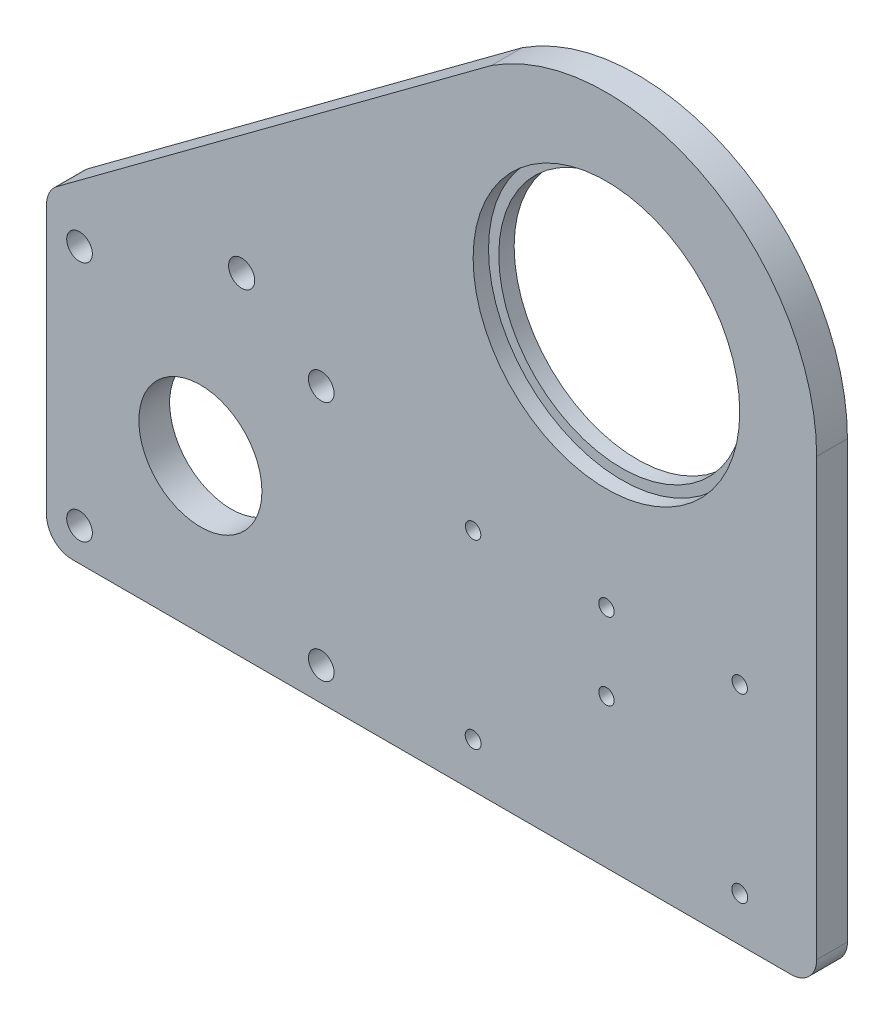
ISO-10303-21;
HEADER;
FILE_DESCRIPTION(('STEP AP214'),'2;1');
FILE_NAME('part.step','',(''),(''),'','','');
FILE_SCHEMA(('AUTOMOTIVE_DESIGN { 1 0 10303 214 1 1 1 1 }'));
ENDSEC;
DATA;
#1=APPLICATION_CONTEXT('core data for automotive mechanical design processes');
#2=APPLICATION_PROTOCOL_DEFINITION('international standard','automotive_design',2000,#1);
#3=PRODUCT_CONTEXT('',#1,'mechanical');
#4=PRODUCT('Part','Part','',(#3));
#5=PRODUCT_RELATED_PRODUCT_CATEGORY('part','',(#4));
#6=PRODUCT_DEFINITION_FORMATION('','',#4);
#7=PRODUCT_DEFINITION_CONTEXT('part definition',#1,'design');
#8=PRODUCT_DEFINITION('design','',#6,#7);
#9=PRODUCT_DEFINITION_SHAPE('','',#8);
#10=(LENGTH_UNIT() NAMED_UNIT(*) SI_UNIT(.MILLI.,.METRE.));
#11=(NAMED_UNIT(*) PLANE_ANGLE_UNIT() SI_UNIT($,.RADIAN.));
#12=(NAMED_UNIT(*) SI_UNIT($,.STERADIAN.) SOLID_ANGLE_UNIT());
#13=UNCERTAINTY_MEASURE_WITH_UNIT(LENGTH_MEASURE(1.E-05),#10,'distance_accuracy_value','');
#14=(GEOMETRIC_REPRESENTATION_CONTEXT(3) GLOBAL_UNCERTAINTY_ASSIGNED_CONTEXT((#13)) GLOBAL_UNIT_ASSIGNED_CONTEXT((#10,
#11,#12)) REPRESENTATION_CONTEXT('',''));
#15=CARTESIAN_POINT('',(0.,0.,0.));
#16=DIRECTION('',(0.,0.,1.));
#17=DIRECTION('',(1.,0.,0.));
#18=AXIS2_PLACEMENT_3D('',#15,#16,#17);
#19=CARTESIAN_POINT('',(79.1876354946597,59.9978406675183,10.));
#20=DIRECTION('',(0.,0.,-1.));
#21=DIRECTION('',(-1.,0.,0.));
#22=AXIS2_PLACEMENT_3D('',#19,#20,#21);
#23=CYLINDRICAL_SURFACE('',#22,26.);
#24=CARTESIAN_POINT('',(79.1876354946597,59.9978406675183,3.));
#25=DIRECTION('',(0.,0.,-1.));
#26=DIRECTION('',(-1.,0.,0.));
#27=AXIS2_PLACEMENT_3D('',#24,#25,#26);
#28=CIRCLE('',#27,26.);
#29=CARTESIAN_POINT('',(53.1876354946597,59.9978406675183,3.));
#30=VERTEX_POINT('',#29);
#31=EDGE_CURVE('E159',#30,#30,#28,.T.);
#32=ORIENTED_EDGE('',*,*,#31,.T.);
#33=EDGE_LOOP('',(#32));
#34=FACE_BOUND('',#33,.T.);
#35=CARTESIAN_POINT('',(79.1876354946597,59.9978406675183,6.));
#36=DIRECTION('',(0.,0.,1.));
#37=DIRECTION('',(1.,0.,0.));
#38=AXIS2_PLACEMENT_3D('',#35,#36,#37);
#39=CIRCLE('',#38,26.);
#40=CARTESIAN_POINT('',(105.18763549466,59.9978406675183,6.));
#41=VERTEX_POINT('',#40);
#42=EDGE_CURVE('E183',#41,#41,#39,.T.);
#43=ORIENTED_EDGE('',*,*,#42,.T.);
#44=EDGE_LOOP('',(#43));
#45=FACE_BOUND('',#44,.T.);
#46=ADVANCED_FACE('F38',(#34,#45),#23,.F.);
#47=CARTESIAN_POINT('',(-24.9923103548989,33.7123951906585,10.));
#48=DIRECTION('',(-0.595537784474957,0.803327297720338,0.));
#49=DIRECTION('',(-0.803327297720338,-0.595537784474957,0.));
#50=AXIS2_PLACEMENT_3D('',#47,#48,#49);
#51=PLANE('',#50);
#52=DIRECTION('',(0.,0.,-1.));
#53=VECTOR('',#52,1.);
#54=CARTESIAN_POINT('',(-27.9776889223748,31.499217893013,10.));
#55=LINE('',#54,#53);
#56=CARTESIAN_POINT('',(-27.9776889223748,31.499217893013,0.));
#57=VERTEX_POINT('',#56);
#58=CARTESIAN_POINT('',(-27.9776889223748,31.499217893013,6.));
#59=VERTEX_POINT('',#58);
#60=EDGE_CURVE('E11',#57,#59,#55,.F.);
#61=ORIENTED_EDGE('',*,*,#60,.T.);
#62=DIRECTION('',(-0.803327297720337,-0.595537784474957,0.));
#63=VECTOR('',#62,1.);
#64=CARTESIAN_POINT('',(56.774720343008,94.3294767253129,6.));
#65=LINE('',#64,#63);
#66=CARTESIAN_POINT('',(56.774720343008,94.3294767253129,6.));
#67=VERTEX_POINT('',#66);
#68=EDGE_CURVE('E53',#67,#59,#65,.T.);
#69=ORIENTED_EDGE('',*,*,#68,.F.);
#70=DIRECTION('',(0.,0.,-1.));
#71=VECTOR('',#70,1.);
#72=CARTESIAN_POINT('',(56.774720343008,94.3294767253129,10.));
#73=LINE('',#72,#71);
#74=CARTESIAN_POINT('',(56.774720343008,94.3294767253129,0.));
#75=VERTEX_POINT('',#74);
#76=EDGE_CURVE('E143',#67,#75,#73,.T.);
#77=ORIENTED_EDGE('',*,*,#76,.T.);
#78=DIRECTION('',(0.803327297720337,0.595537784474957,0.));
#79=VECTOR('',#78,1.);
#80=CARTESIAN_POINT('',(-24.9923103548989,33.7123951906585,0.));
#81=LINE('',#80,#79);
#82=EDGE_CURVE('E156',#57,#75,#81,.T.);
#83=ORIENTED_EDGE('',*,*,#82,.F.);
#84=EDGE_LOOP('',(#61,#69,#77,#83));
#85=FACE_BOUND('',#84,.T.);
#86=ADVANCED_FACE('F308',(#85),#51,.T.);
#87=CARTESIAN_POINT('',(-30.,0.,10.));
#88=DIRECTION('',(-1.,0.,0.));
#89=DIRECTION('',(0.,0.,1.));
#90=AXIS2_PLACEMENT_3D('',#87,#88,#89);
#91=PLANE('',#90);
#92=DIRECTION('',(0.,0.,-1.));
#93=VECTOR('',#92,1.);
#94=CARTESIAN_POINT('',(-30.,-25.,10.));
#95=LINE('',#94,#93);
#96=CARTESIAN_POINT('',(-30.,-25.,0.));
#97=VERTEX_POINT('',#96);
#98=CARTESIAN_POINT('',(-30.,-25.,6.));
#99=VERTEX_POINT('',#98);
#100=EDGE_CURVE('E128',#97,#99,#95,.F.);
#101=ORIENTED_EDGE('',*,*,#100,.T.);
#102=DIRECTION('',(0.,-1.,0.));
#103=VECTOR('',#102,1.);
#104=CARTESIAN_POINT('',(-30.,27.4825814044113,6.));
#105=LINE('',#104,#103);
#106=CARTESIAN_POINT('',(-30.,27.4825814044113,6.));
#107=VERTEX_POINT('',#106);
#108=EDGE_CURVE('E201',#107,#99,#105,.T.);
#109=ORIENTED_EDGE('',*,*,#108,.F.);
#110=DIRECTION('',(0.,0.,-1.));
#111=VECTOR('',#110,1.);
#112=CARTESIAN_POINT('',(-30.,27.4825814044113,10.));
#113=LINE('',#112,#111);
#114=CARTESIAN_POINT('',(-30.,27.4825814044113,0.));
#115=VERTEX_POINT('',#114);
#116=EDGE_CURVE('E61',#107,#115,#113,.T.);
#117=ORIENTED_EDGE('',*,*,#116,.T.);
#118=DIRECTION('',(0.,1.,0.));
#119=VECTOR('',#118,1.);
#120=CARTESIAN_POINT('',(-30.,0.,0.));
#121=LINE('',#120,#119);
#122=EDGE_CURVE('E153',#97,#115,#121,.T.);
#123=ORIENTED_EDGE('',*,*,#122,.F.);
#124=EDGE_LOOP('',(#101,#109,#117,#123));
#125=FACE_BOUND('',#124,.T.);
#126=ADVANCED_FACE('F314',(#125),#91,.T.);
#127=CARTESIAN_POINT('',(0.,-30.,10.));
#128=DIRECTION('',(0.,-1.,0.));
#129=DIRECTION('',(0.,0.,-1.));
#130=AXIS2_PLACEMENT_3D('',#127,#128,#129);
#131=PLANE('',#130);
#132=DIRECTION('',(0.,0.,-1.));
#133=VECTOR('',#132,1.);
#134=CARTESIAN_POINT('',(115.18763549466,-30.,10.));
#135=LINE('',#134,#133);
#136=CARTESIAN_POINT('',(115.18763549466,-30.,0.));
#137=VERTEX_POINT('',#136);
#138=CARTESIAN_POINT('',(115.18763549466,-30.,6.));
#139=VERTEX_POINT('',#138);
#140=EDGE_CURVE('E140',#137,#139,#135,.F.);
#141=ORIENTED_EDGE('',*,*,#140,.T.);
#142=DIRECTION('',(1.,0.,0.));
#143=VECTOR('',#142,1.);
#144=CARTESIAN_POINT('',(-25.,-30.,6.));
#145=LINE('',#144,#143);
#146=CARTESIAN_POINT('',(-25.,-30.,6.));
#147=VERTEX_POINT('',#146);
#148=EDGE_CURVE('E110',#147,#139,#145,.T.);
#149=ORIENTED_EDGE('',*,*,#148,.F.);
#150=DIRECTION('',(0.,0.,-1.));
#151=VECTOR('',#150,1.);
#152=CARTESIAN_POINT('',(-25.,-30.,10.));
#153=LINE('',#152,#151);
#154=CARTESIAN_POINT('',(-25.,-30.,0.));
#155=VERTEX_POINT('',#154);
#156=EDGE_CURVE('E138',#147,#155,#153,.T.);
#157=ORIENTED_EDGE('',*,*,#156,.T.);
#158=DIRECTION('',(-1.,0.,0.));
#159=VECTOR('',#158,1.);
#160=CARTESIAN_POINT('',(0.,-30.,0.));
#161=LINE('',#160,#159);
#162=EDGE_CURVE('E150',#137,#155,#161,.T.);
#163=ORIENTED_EDGE('',*,*,#162,.F.);
#164=EDGE_LOOP('',(#141,#149,#157,#163));
#165=FACE_BOUND('',#164,.T.);
#166=ADVANCED_FACE('F326',(#165),#131,.T.);
#167=CARTESIAN_POINT('',(120.18763549466,0.,10.));
#168=DIRECTION('',(1.,0.,0.));
#169=DIRECTION('',(0.,0.,-1.));
#170=AXIS2_PLACEMENT_3D('',#167,#168,#169);
#171=PLANE('',#170);
#172=DIRECTION('',(0.,0.,-1.));
#173=VECTOR('',#172,1.);
#174=CARTESIAN_POINT('',(120.18763549466,59.9978406675183,10.));
#175=LINE('',#174,#173);
#176=CARTESIAN_POINT('',(120.18763549466,59.9978406675183,6.));
#177=VERTEX_POINT('',#176);
#178=CARTESIAN_POINT('',(120.18763549466,59.9978406675183,0.));
#179=VERTEX_POINT('',#178);
#180=EDGE_CURVE('E122',#177,#179,#175,.T.);
#181=ORIENTED_EDGE('',*,*,#180,.F.);
#182=DIRECTION('',(0.,1.,0.));
#183=VECTOR('',#182,1.);
#184=CARTESIAN_POINT('',(120.18763549466,-25.,6.));
#185=LINE('',#184,#183);
#186=CARTESIAN_POINT('',(120.18763549466,-25.,6.));
#187=VERTEX_POINT('',#186);
#188=EDGE_CURVE('E107',#187,#177,#185,.T.);
#189=ORIENTED_EDGE('',*,*,#188,.F.);
#190=DIRECTION('',(0.,0.,-1.));
#191=VECTOR('',#190,1.);
#192=CARTESIAN_POINT('',(120.18763549466,-25.,10.));
#193=LINE('',#192,#191);
#194=CARTESIAN_POINT('',(120.18763549466,-25.,0.));
#195=VERTEX_POINT('',#194);
#196=EDGE_CURVE('E46',#187,#195,#193,.T.);
#197=ORIENTED_EDGE('',*,*,#196,.T.);
#198=DIRECTION('',(0.,-1.,0.));
#199=VECTOR('',#198,1.);
#200=CARTESIAN_POINT('',(120.18763549466,0.,0.));
#201=LINE('',#200,#199);
#202=EDGE_CURVE('E148',#179,#195,#201,.T.);
#203=ORIENTED_EDGE('',*,*,#202,.F.);
#204=EDGE_LOOP('',(#181,#189,#197,#203));
#205=FACE_BOUND('',#204,.T.);
#206=ADVANCED_FACE('F119',(#205),#171,.T.);
#207=CARTESIAN_POINT('',(79.1876354946597,59.9978406675183,10.));
#208=DIRECTION('',(0.,0.,-1.));
#209=DIRECTION('',(-1.,0.,0.));
#210=AXIS2_PLACEMENT_3D('',#207,#208,#209);
#211=CYLINDRICAL_SURFACE('',#210,41.);
#212=CARTESIAN_POINT('',(79.1876354946597,59.9978406675183,6.));
#213=DIRECTION('',(0.,0.,1.));
#214=DIRECTION('',(1.,0.,0.));
#215=AXIS2_PLACEMENT_3D('',#212,#213,#214);
#216=CIRCLE('',#215,41.);
#217=EDGE_CURVE('E123',#177,#67,#216,.T.);
#218=ORIENTED_EDGE('',*,*,#217,.F.);
#219=ORIENTED_EDGE('',*,*,#180,.T.);
#220=CARTESIAN_POINT('',(79.1876354946597,59.9978406675183,0.));
#221=DIRECTION('',(0.,0.,1.));
#222=DIRECTION('',(1.,0.,0.));
#223=AXIS2_PLACEMENT_3D('',#220,#221,#222);
#224=CIRCLE('',#223,41.);
#225=EDGE_CURVE('E145',#179,#75,#224,.T.);
#226=ORIENTED_EDGE('',*,*,#225,.T.);
#227=ORIENTED_EDGE('',*,*,#76,.F.);
#228=EDGE_LOOP('',(#218,#219,#226,#227));
#229=FACE_BOUND('',#228,.T.);
#230=ADVANCED_FACE('F319',(#229),#211,.T.);
#231=CARTESIAN_POINT('',(-25.,-25.,10.));
#232=DIRECTION('',(0.,0.,-1.));
#233=DIRECTION('',(-1.,0.,0.));
#234=AXIS2_PLACEMENT_3D('',#231,#232,#233);
#235=CYLINDRICAL_SURFACE('',#234,5.);
#236=ORIENTED_EDGE('',*,*,#156,.F.);
#237=CARTESIAN_POINT('',(-25.,-25.,6.));
#238=DIRECTION('',(0.,0.,1.));
#239=DIRECTION('',(1.,0.,0.));
#240=AXIS2_PLACEMENT_3D('',#237,#238,#239);
#241=CIRCLE('',#240,5.);
#242=EDGE_CURVE('E199',#99,#147,#241,.T.);
#243=ORIENTED_EDGE('',*,*,#242,.F.);
#244=ORIENTED_EDGE('',*,*,#100,.F.);
#245=CARTESIAN_POINT('',(-25.,-25.,0.));
#246=DIRECTION('',(0.,0.,1.));
#247=DIRECTION('',(1.,0.,0.));
#248=AXIS2_PLACEMENT_3D('',#245,#246,#247);
#249=CIRCLE('',#248,5.);
#250=EDGE_CURVE('E133',#155,#97,#249,.F.);
#251=ORIENTED_EDGE('',*,*,#250,.F.);
#252=EDGE_LOOP('',(#236,#243,#244,#251));
#253=FACE_BOUND('',#252,.T.);
#254=ADVANCED_FACE('F322',(#253),#235,.T.);
#255=CARTESIAN_POINT('',(115.18763549466,-25.,10.));
#256=DIRECTION('',(0.,0.,-1.));
#257=DIRECTION('',(-1.,0.,0.));
#258=AXIS2_PLACEMENT_3D('',#255,#256,#257);
#259=CYLINDRICAL_SURFACE('',#258,5.);
#260=ORIENTED_EDGE('',*,*,#196,.F.);
#261=CARTESIAN_POINT('',(115.18763549466,-25.,6.));
#262=DIRECTION('',(0.,0.,1.));
#263=DIRECTION('',(1.,0.,0.));
#264=AXIS2_PLACEMENT_3D('',#261,#262,#263);
#265=CIRCLE('',#264,5.);
#266=EDGE_CURVE('E103',#139,#187,#265,.T.);
#267=ORIENTED_EDGE('',*,*,#266,.F.);
#268=ORIENTED_EDGE('',*,*,#140,.F.);
#269=CARTESIAN_POINT('',(115.18763549466,-25.,0.));
#270=DIRECTION('',(0.,0.,1.));
#271=DIRECTION('',(1.,0.,0.));
#272=AXIS2_PLACEMENT_3D('',#269,#270,#271);
#273=CIRCLE('',#272,5.);
#274=EDGE_CURVE('E126',#195,#137,#273,.F.);
#275=ORIENTED_EDGE('',*,*,#274,.F.);
#276=EDGE_LOOP('',(#260,#267,#268,#275));
#277=FACE_BOUND('',#276,.T.);
#278=ADVANCED_FACE('F125',(#277),#259,.T.);
#279=CARTESIAN_POINT('',(-25.,27.4825814044113,10.));
#280=DIRECTION('',(0.,0.,-1.));
#281=DIRECTION('',(-1.,0.,0.));
#282=AXIS2_PLACEMENT_3D('',#279,#280,#281);
#283=CYLINDRICAL_SURFACE('',#282,5.);
#284=ORIENTED_EDGE('',*,*,#116,.F.);
#285=CARTESIAN_POINT('',(-25.,27.4825814044113,6.));
#286=DIRECTION('',(0.,0.,1.));
#287=DIRECTION('',(1.,0.,0.));
#288=AXIS2_PLACEMENT_3D('',#285,#286,#287);
#289=CIRCLE('',#288,5.);
#290=EDGE_CURVE('E203',#59,#107,#289,.T.);
#291=ORIENTED_EDGE('',*,*,#290,.F.);
#292=ORIENTED_EDGE('',*,*,#60,.F.);
#293=CARTESIAN_POINT('',(-25.,27.4825814044113,0.));
#294=DIRECTION('',(0.,0.,1.));
#295=DIRECTION('',(1.,0.,0.));
#296=AXIS2_PLACEMENT_3D('',#293,#294,#295);
#297=CIRCLE('',#296,5.);
#298=EDGE_CURVE('E136',#115,#57,#297,.F.);
#299=ORIENTED_EDGE('',*,*,#298,.F.);
#300=EDGE_LOOP('',(#284,#291,#292,#299));
#301=FACE_BOUND('',#300,.T.);
#302=ADVANCED_FACE('F40',(#301),#283,.T.);
#303=CARTESIAN_POINT('',(23.57,23.57,0.));
#304=DIRECTION('',(0.,0.,1.));
#305=DIRECTION('',(1.,0.,0.));
#306=AXIS2_PLACEMENT_3D('',#303,#304,#305);
#307=CYLINDRICAL_SURFACE('',#306,2.5);
#308=CARTESIAN_POINT('',(23.57,23.57,0.));
#309=DIRECTION('',(0.,0.,1.));
#310=DIRECTION('',(1.,0.,0.));
#311=AXIS2_PLACEMENT_3D('',#308,#309,#310);
#312=CIRCLE('',#311,2.5);
#313=CARTESIAN_POINT('',(26.07,23.57,0.));
#314=VERTEX_POINT('',#313);
#315=EDGE_CURVE('E166',#314,#314,#312,.T.);
#316=ORIENTED_EDGE('',*,*,#315,.F.);
#317=EDGE_LOOP('',(#316));
#318=FACE_BOUND('',#317,.T.);
#319=CARTESIAN_POINT('',(23.57,23.57,6.));
#320=DIRECTION('',(0.,0.,1.));
#321=DIRECTION('',(1.,0.,0.));
#322=AXIS2_PLACEMENT_3D('',#319,#320,#321);
#323=CIRCLE('',#322,2.5);
#324=CARTESIAN_POINT('',(26.07,23.57,6.));
#325=VERTEX_POINT('',#324);
#326=EDGE_CURVE('E186',#325,#325,#323,.F.);
#327=ORIENTED_EDGE('',*,*,#326,.F.);
#328=EDGE_LOOP('',(#327));
#329=FACE_BOUND('',#328,.T.);
#330=ADVANCED_FACE('F338',(#318,#329),#307,.F.);
#331=CARTESIAN_POINT('',(-23.57,-23.57,0.));
#332=DIRECTION('',(0.,0.,1.));
#333=DIRECTION('',(1.,0.,0.));
#334=AXIS2_PLACEMENT_3D('',#331,#332,#333);
#335=CYLINDRICAL_SURFACE('',#334,2.5);
#336=CARTESIAN_POINT('',(-23.57,-23.57,0.));
#337=DIRECTION('',(0.,0.,1.));
#338=DIRECTION('',(1.,0.,0.));
#339=AXIS2_PLACEMENT_3D('',#336,#337,#338);
#340=CIRCLE('',#339,2.5);
#341=CARTESIAN_POINT('',(-21.07,-23.57,0.));
#342=VERTEX_POINT('',#341);
#343=EDGE_CURVE('E171',#342,#342,#340,.T.);
#344=ORIENTED_EDGE('',*,*,#343,.F.);
#345=EDGE_LOOP('',(#344));
#346=FACE_BOUND('',#345,.T.);
#347=CARTESIAN_POINT('',(-23.57,-23.57,6.));
#348=DIRECTION('',(0.,0.,1.));
#349=DIRECTION('',(1.,0.,0.));
#350=AXIS2_PLACEMENT_3D('',#347,#348,#349);
#351=CIRCLE('',#350,2.5);
#352=CARTESIAN_POINT('',(-21.07,-23.57,6.));
#353=VERTEX_POINT('',#352);
#354=EDGE_CURVE('E189',#353,#353,#351,.F.);
#355=ORIENTED_EDGE('',*,*,#354,.F.);
#356=EDGE_LOOP('',(#355));
#357=FACE_BOUND('',#356,.T.);
#358=ADVANCED_FACE('F343',(#346,#357),#335,.F.);
#359=CARTESIAN_POINT('',(-23.57,23.57,0.));
#360=DIRECTION('',(0.,0.,1.));
#361=DIRECTION('',(1.,0.,0.));
#362=AXIS2_PLACEMENT_3D('',#359,#360,#361);
#363=CYLINDRICAL_SURFACE('',#362,2.5);
#364=CARTESIAN_POINT('',(-23.57,23.57,0.));
#365=DIRECTION('',(0.,0.,1.));
#366=DIRECTION('',(1.,0.,0.));
#367=AXIS2_PLACEMENT_3D('',#364,#365,#366);
#368=CIRCLE('',#367,2.5);
#369=CARTESIAN_POINT('',(-21.07,23.57,0.));
#370=VERTEX_POINT('',#369);
#371=EDGE_CURVE('E175',#370,#370,#368,.T.);
#372=ORIENTED_EDGE('',*,*,#371,.F.);
#373=EDGE_LOOP('',(#372));
#374=FACE_BOUND('',#373,.T.);
#375=CARTESIAN_POINT('',(-23.57,23.57,6.));
#376=DIRECTION('',(0.,0.,1.));
#377=DIRECTION('',(1.,0.,0.));
#378=AXIS2_PLACEMENT_3D('',#375,#376,#377);
#379=CIRCLE('',#378,2.5);
#380=CARTESIAN_POINT('',(-21.07,23.57,6.));
#381=VERTEX_POINT('',#380);
#382=EDGE_CURVE('E192',#381,#381,#379,.F.);
#383=ORIENTED_EDGE('',*,*,#382,.F.);
#384=EDGE_LOOP('',(#383));
#385=FACE_BOUND('',#384,.T.);
#386=ADVANCED_FACE('F356',(#374,#385),#363,.F.);
#387=CARTESIAN_POINT('',(23.57,-23.57,0.));
#388=DIRECTION('',(0.,0.,1.));
#389=DIRECTION('',(1.,0.,0.));
#390=AXIS2_PLACEMENT_3D('',#387,#388,#389);
#391=CYLINDRICAL_SURFACE('',#390,2.5);
#392=CARTESIAN_POINT('',(23.57,-23.57,0.));
#393=DIRECTION('',(0.,0.,1.));
#394=DIRECTION('',(1.,0.,0.));
#395=AXIS2_PLACEMENT_3D('',#392,#393,#394);
#396=CIRCLE('',#395,2.5);
#397=CARTESIAN_POINT('',(26.07,-23.57,0.));
#398=VERTEX_POINT('',#397);
#399=EDGE_CURVE('E172',#398,#398,#396,.T.);
#400=ORIENTED_EDGE('',*,*,#399,.F.);
#401=EDGE_LOOP('',(#400));
#402=FACE_BOUND('',#401,.T.);
#403=CARTESIAN_POINT('',(23.57,-23.57,6.));
#404=DIRECTION('',(0.,0.,1.));
#405=DIRECTION('',(1.,0.,0.));
#406=AXIS2_PLACEMENT_3D('',#403,#404,#405);
#407=CIRCLE('',#406,2.5);
#408=CARTESIAN_POINT('',(26.07,-23.57,6.));
#409=VERTEX_POINT('',#408);
#410=EDGE_CURVE('E195',#409,#409,#407,.F.);
#411=ORIENTED_EDGE('',*,*,#410,.F.);
#412=EDGE_LOOP('',(#411));
#413=FACE_BOUND('',#412,.T.);
#414=ADVANCED_FACE('F361',(#402,#413),#391,.F.);
#415=CARTESIAN_POINT('',(0.,0.,0.));
#416=DIRECTION('',(0.,0.,1.));
#417=DIRECTION('',(1.,0.,0.));
#418=AXIS2_PLACEMENT_3D('',#415,#416,#417);
#419=CYLINDRICAL_SURFACE('',#418,12.);
#420=CARTESIAN_POINT('',(0.,0.,0.));
#421=DIRECTION('',(0.,0.,1.));
#422=DIRECTION('',(1.,0.,0.));
#423=AXIS2_PLACEMENT_3D('',#420,#421,#422);
#424=CIRCLE('',#423,12.);
#425=CARTESIAN_POINT('',(12.,0.,0.));
#426=VERTEX_POINT('',#425);
#427=EDGE_CURVE('E176',#426,#426,#424,.T.);
#428=ORIENTED_EDGE('',*,*,#427,.F.);
#429=EDGE_LOOP('',(#428));
#430=FACE_BOUND('',#429,.T.);
#431=CARTESIAN_POINT('',(0.,0.,6.));
#432=DIRECTION('',(0.,0.,1.));
#433=DIRECTION('',(1.,0.,0.));
#434=AXIS2_PLACEMENT_3D('',#431,#432,#433);
#435=CIRCLE('',#434,12.);
#436=CARTESIAN_POINT('',(12.,0.,6.));
#437=VERTEX_POINT('',#436);
#438=EDGE_CURVE('E115',#437,#437,#435,.T.);
#439=ORIENTED_EDGE('',*,*,#438,.T.);
#440=EDGE_LOOP('',(#439));
#441=FACE_BOUND('',#440,.T.);
#442=ADVANCED_FACE('F265',(#430,#441),#419,.F.);
#443=CARTESIAN_POINT('',(0.,0.,0.));
#444=DIRECTION('',(0.,0.,1.));
#445=DIRECTION('',(1.,0.,0.));
#446=AXIS2_PLACEMENT_3D('',#443,#444,#445);
#447=PLANE('',#446);
#448=CARTESIAN_POINT('',(8.04391097791209,34.8873944266652,0.));
#449=DIRECTION('',(0.,0.,-1.));
#450=DIRECTION('',(-1.,0.,0.));
#451=AXIS2_PLACEMENT_3D('',#448,#449,#450);
#452=CIRCLE('',#451,2.55);
#453=CARTESIAN_POINT('',(5.49391097791209,34.8873944266652,0.));
#454=VERTEX_POINT('',#453);
#455=EDGE_CURVE('E246',#454,#454,#452,.T.);
#456=ORIENTED_EDGE('',*,*,#455,.F.);
#457=EDGE_LOOP('',(#456));
#458=FACE_BOUND('',#457,.T.);
#459=CARTESIAN_POINT('',(105.18763549466,-21.3,0.));
#460=DIRECTION('',(0.,0.,1.));
#461=DIRECTION('',(1.,0.,0.));
#462=AXIS2_PLACEMENT_3D('',#459,#460,#461);
#463=CIRCLE('',#462,1.54999999999999);
#464=CARTESIAN_POINT('',(106.73763549466,-21.3,0.));
#465=VERTEX_POINT('',#464);
#466=EDGE_CURVE('E231',#465,#465,#463,.T.);
#467=ORIENTED_EDGE('',*,*,#466,.T.);
#468=EDGE_LOOP('',(#467));
#469=FACE_BOUND('',#468,.T.);
#470=CARTESIAN_POINT('',(53.1876354946597,-21.3,0.));
#471=DIRECTION('',(0.,0.,1.));
#472=DIRECTION('',(1.,0.,0.));
#473=AXIS2_PLACEMENT_3D('',#470,#471,#472);
#474=CIRCLE('',#473,1.55);
#475=CARTESIAN_POINT('',(54.7376354946597,-21.3,0.));
#476=VERTEX_POINT('',#475);
#477=EDGE_CURVE('E237',#476,#476,#474,.T.);
#478=ORIENTED_EDGE('',*,*,#477,.T.);
#479=EDGE_LOOP('',(#478));
#480=FACE_BOUND('',#479,.T.);
#481=CARTESIAN_POINT('',(105.18763549466,13.9978406675183,0.));
#482=DIRECTION('',(0.,0.,1.));
#483=DIRECTION('',(1.,0.,0.));
#484=AXIS2_PLACEMENT_3D('',#481,#482,#483);
#485=CIRCLE('',#484,1.5);
#486=CARTESIAN_POINT('',(106.68763549466,13.9978406675183,0.));
#487=VERTEX_POINT('',#486);
#488=EDGE_CURVE('E209',#487,#487,#485,.T.);
#489=ORIENTED_EDGE('',*,*,#488,.T.);
#490=EDGE_LOOP('',(#489));
#491=FACE_BOUND('',#490,.T.);
#492=CARTESIAN_POINT('',(79.1876354946597,-1.00215933248166,0.));
#493=DIRECTION('',(0.,0.,1.));
#494=DIRECTION('',(1.,0.,0.));
#495=AXIS2_PLACEMENT_3D('',#492,#493,#494);
#496=CIRCLE('',#495,1.5);
#497=CARTESIAN_POINT('',(80.6876354946597,-1.00215933248166,0.));
#498=VERTEX_POINT('',#497);
#499=EDGE_CURVE('E220',#498,#498,#496,.T.);
#500=ORIENTED_EDGE('',*,*,#499,.T.);
#501=EDGE_LOOP('',(#500));
#502=FACE_BOUND('',#501,.T.);
#503=CARTESIAN_POINT('',(53.1876354946597,13.9978406675183,0.));
#504=DIRECTION('',(0.,0.,1.));
#505=DIRECTION('',(1.,0.,0.));
#506=AXIS2_PLACEMENT_3D('',#503,#504,#505);
#507=CIRCLE('',#506,1.5);
#508=CARTESIAN_POINT('',(54.6876354946597,13.9978406675183,0.));
#509=VERTEX_POINT('',#508);
#510=EDGE_CURVE('E213',#509,#509,#507,.T.);
#511=ORIENTED_EDGE('',*,*,#510,.T.);
#512=EDGE_LOOP('',(#511));
#513=FACE_BOUND('',#512,.T.);
#514=CARTESIAN_POINT('',(79.1876354946597,13.9978406675183,0.));
#515=DIRECTION('',(0.,0.,1.));
#516=DIRECTION('',(1.,0.,0.));
#517=AXIS2_PLACEMENT_3D('',#514,#515,#516);
#518=CIRCLE('',#517,1.5);
#519=CARTESIAN_POINT('',(80.6876354946597,13.9978406675183,0.));
#520=VERTEX_POINT('',#519);
#521=EDGE_CURVE('E214',#520,#520,#518,.T.);
#522=ORIENTED_EDGE('',*,*,#521,.T.);
#523=EDGE_LOOP('',(#522));
#524=FACE_BOUND('',#523,.T.);
#525=ORIENTED_EDGE('',*,*,#427,.T.);
#526=EDGE_LOOP('',(#525));
#527=FACE_BOUND('',#526,.T.);
#528=ORIENTED_EDGE('',*,*,#399,.T.);
#529=EDGE_LOOP('',(#528));
#530=FACE_BOUND('',#529,.T.);
#531=ORIENTED_EDGE('',*,*,#371,.T.);
#532=EDGE_LOOP('',(#531));
#533=FACE_BOUND('',#532,.T.);
#534=ORIENTED_EDGE('',*,*,#343,.T.);
#535=EDGE_LOOP('',(#534));
#536=FACE_BOUND('',#535,.T.);
#537=ORIENTED_EDGE('',*,*,#315,.T.);
#538=EDGE_LOOP('',(#537));
#539=FACE_BOUND('',#538,.T.);
#540=ORIENTED_EDGE('',*,*,#162,.T.);
#541=ORIENTED_EDGE('',*,*,#250,.T.);
#542=ORIENTED_EDGE('',*,*,#122,.T.);
#543=ORIENTED_EDGE('',*,*,#298,.T.);
#544=ORIENTED_EDGE('',*,*,#82,.T.);
#545=ORIENTED_EDGE('',*,*,#225,.F.);
#546=ORIENTED_EDGE('',*,*,#202,.T.);
#547=ORIENTED_EDGE('',*,*,#274,.T.);
#548=EDGE_LOOP('',(#540,#541,#542,#543,#544,#545,#546,#547));
#549=FACE_BOUND('',#548,.T.);
#550=CARTESIAN_POINT('',(79.1876354946597,59.9978406675183,0.));
#551=DIRECTION('',(0.,0.,-1.));
#552=DIRECTION('',(-1.,0.,0.));
#553=AXIS2_PLACEMENT_3D('',#550,#551,#552);
#554=CIRCLE('',#553,24.);
#555=CARTESIAN_POINT('',(55.1876354946597,59.9978406675183,0.));
#556=VERTEX_POINT('',#555);
#557=EDGE_CURVE('E163',#556,#556,#554,.T.);
#558=ORIENTED_EDGE('',*,*,#557,.F.);
#559=EDGE_LOOP('',(#558));
#560=FACE_BOUND('',#559,.T.);
#561=ADVANCED_FACE('F261',(#458,#469,#480,#491,#502,#513,#524,#527,#530,#533,#536,#539,#549,
#560),#447,.F.);
#562=CARTESIAN_POINT('',(79.1876354946597,59.9978406675183,3.));
#563=DIRECTION('',(0.,0.,-1.));
#564=DIRECTION('',(-1.,0.,0.));
#565=AXIS2_PLACEMENT_3D('',#562,#563,#564);
#566=PLANE('',#565);
#567=CARTESIAN_POINT('',(79.1876354946597,59.9978406675183,3.));
#568=DIRECTION('',(0.,0.,-1.));
#569=DIRECTION('',(-1.,0.,0.));
#570=AXIS2_PLACEMENT_3D('',#567,#568,#569);
#571=CIRCLE('',#570,24.);
#572=CARTESIAN_POINT('',(55.1876354946597,59.9978406675183,3.));
#573=VERTEX_POINT('',#572);
#574=EDGE_CURVE('E162',#573,#573,#571,.T.);
#575=ORIENTED_EDGE('',*,*,#574,.T.);
#576=EDGE_LOOP('',(#575));
#577=FACE_BOUND('',#576,.T.);
#578=ORIENTED_EDGE('',*,*,#31,.F.);
#579=EDGE_LOOP('',(#578));
#580=FACE_BOUND('',#579,.T.);
#581=ADVANCED_FACE('F264',(#577,#580),#566,.F.);
#582=CARTESIAN_POINT('',(79.1876354946597,59.9978406675183,3.));
#583=DIRECTION('',(0.,0.,-1.));
#584=DIRECTION('',(-1.,0.,0.));
#585=AXIS2_PLACEMENT_3D('',#582,#583,#584);
#586=CYLINDRICAL_SURFACE('',#585,24.);
#587=ORIENTED_EDGE('',*,*,#574,.F.);
#588=EDGE_LOOP('',(#587));
#589=FACE_BOUND('',#588,.T.);
#590=ORIENTED_EDGE('',*,*,#557,.T.);
#591=EDGE_LOOP('',(#590));
#592=FACE_BOUND('',#591,.T.);
#593=ADVANCED_FACE('F293',(#589,#592),#586,.F.);
#594=CARTESIAN_POINT('',(115.18763549466,-25.,6.));
#595=DIRECTION('',(0.,0.,1.));
#596=DIRECTION('',(1.,0.,0.));
#597=AXIS2_PLACEMENT_3D('',#594,#595,#596);
#598=PLANE('',#597);
#599=CARTESIAN_POINT('',(8.04391097791209,34.8873944266652,6.));
#600=DIRECTION('',(0.,0.,-1.));
#601=DIRECTION('',(-1.,0.,0.));
#602=AXIS2_PLACEMENT_3D('',#599,#600,#601);
#603=CIRCLE('',#602,2.55);
#604=CARTESIAN_POINT('',(5.49391097791209,34.8873944266652,6.));
#605=VERTEX_POINT('',#604);
#606=EDGE_CURVE('E238',#605,#605,#603,.T.);
#607=ORIENTED_EDGE('',*,*,#606,.T.);
#608=EDGE_LOOP('',(#607));
#609=FACE_BOUND('',#608,.T.);
#610=CARTESIAN_POINT('',(105.18763549466,-21.3,6.));
#611=DIRECTION('',(0.,0.,1.));
#612=DIRECTION('',(1.,0.,0.));
#613=AXIS2_PLACEMENT_3D('',#610,#611,#612);
#614=CIRCLE('',#613,1.54999999999999);
#615=CARTESIAN_POINT('',(106.73763549466,-21.3,6.));
#616=VERTEX_POINT('',#615);
#617=EDGE_CURVE('E241',#616,#616,#614,.T.);
#618=ORIENTED_EDGE('',*,*,#617,.F.);
#619=EDGE_LOOP('',(#618));
#620=FACE_BOUND('',#619,.T.);
#621=CARTESIAN_POINT('',(53.1876354946597,-21.3,6.));
#622=DIRECTION('',(0.,0.,1.));
#623=DIRECTION('',(1.,0.,0.));
#624=AXIS2_PLACEMENT_3D('',#621,#622,#623);
#625=CIRCLE('',#624,1.55);
#626=CARTESIAN_POINT('',(54.7376354946597,-21.3,6.));
#627=VERTEX_POINT('',#626);
#628=EDGE_CURVE('E234',#627,#627,#625,.T.);
#629=ORIENTED_EDGE('',*,*,#628,.F.);
#630=EDGE_LOOP('',(#629));
#631=FACE_BOUND('',#630,.T.);
#632=CARTESIAN_POINT('',(105.18763549466,13.9978406675183,6.));
#633=DIRECTION('',(0.,0.,1.));
#634=DIRECTION('',(1.,0.,0.));
#635=AXIS2_PLACEMENT_3D('',#632,#633,#634);
#636=CIRCLE('',#635,1.5);
#637=CARTESIAN_POINT('',(106.68763549466,13.9978406675183,6.));
#638=VERTEX_POINT('',#637);
#639=EDGE_CURVE('E223',#638,#638,#636,.T.);
#640=ORIENTED_EDGE('',*,*,#639,.F.);
#641=EDGE_LOOP('',(#640));
#642=FACE_BOUND('',#641,.T.);
#643=CARTESIAN_POINT('',(79.1876354946597,-1.00215933248166,6.));
#644=DIRECTION('',(0.,0.,1.));
#645=DIRECTION('',(1.,0.,0.));
#646=AXIS2_PLACEMENT_3D('',#643,#644,#645);
#647=CIRCLE('',#646,1.5);
#648=CARTESIAN_POINT('',(80.6876354946597,-1.00215933248166,6.));
#649=VERTEX_POINT('',#648);
#650=EDGE_CURVE('E217',#649,#649,#647,.T.);
#651=ORIENTED_EDGE('',*,*,#650,.F.);
#652=EDGE_LOOP('',(#651));
#653=FACE_BOUND('',#652,.T.);
#654=CARTESIAN_POINT('',(53.1876354946597,13.9978406675183,6.));
#655=DIRECTION('',(0.,0.,1.));
#656=DIRECTION('',(1.,0.,0.));
#657=AXIS2_PLACEMENT_3D('',#654,#655,#656);
#658=CIRCLE('',#657,1.5);
#659=CARTESIAN_POINT('',(54.6876354946597,13.9978406675183,6.));
#660=VERTEX_POINT('',#659);
#661=EDGE_CURVE('E210',#660,#660,#658,.T.);
#662=ORIENTED_EDGE('',*,*,#661,.F.);
#663=EDGE_LOOP('',(#662));
#664=FACE_BOUND('',#663,.T.);
#665=CARTESIAN_POINT('',(79.1876354946597,13.9978406675183,6.));
#666=DIRECTION('',(0.,0.,1.));
#667=DIRECTION('',(1.,0.,0.));
#668=AXIS2_PLACEMENT_3D('',#665,#666,#667);
#669=CIRCLE('',#668,1.5);
#670=CARTESIAN_POINT('',(80.6876354946597,13.9978406675183,6.));
#671=VERTEX_POINT('',#670);
#672=EDGE_CURVE('E228',#671,#671,#669,.T.);
#673=ORIENTED_EDGE('',*,*,#672,.F.);
#674=EDGE_LOOP('',(#673));
#675=FACE_BOUND('',#674,.T.);
#676=ORIENTED_EDGE('',*,*,#42,.F.);
#677=EDGE_LOOP('',(#676));
#678=FACE_BOUND('',#677,.T.);
#679=ORIENTED_EDGE('',*,*,#438,.F.);
#680=EDGE_LOOP('',(#679));
#681=FACE_BOUND('',#680,.T.);
#682=ORIENTED_EDGE('',*,*,#266,.T.);
#683=ORIENTED_EDGE('',*,*,#188,.T.);
#684=ORIENTED_EDGE('',*,*,#217,.T.);
#685=ORIENTED_EDGE('',*,*,#68,.T.);
#686=ORIENTED_EDGE('',*,*,#290,.T.);
#687=ORIENTED_EDGE('',*,*,#108,.T.);
#688=ORIENTED_EDGE('',*,*,#242,.T.);
#689=ORIENTED_EDGE('',*,*,#148,.T.);
#690=EDGE_LOOP('',(#682,#683,#684,#685,#686,#687,#688,#689));
#691=FACE_BOUND('',#690,.T.);
#692=ORIENTED_EDGE('',*,*,#410,.T.);
#693=EDGE_LOOP('',(#692));
#694=FACE_BOUND('',#693,.T.);
#695=ORIENTED_EDGE('',*,*,#382,.T.);
#696=EDGE_LOOP('',(#695));
#697=FACE_BOUND('',#696,.T.);
#698=ORIENTED_EDGE('',*,*,#354,.T.);
#699=EDGE_LOOP('',(#698));
#700=FACE_BOUND('',#699,.T.);
#701=ORIENTED_EDGE('',*,*,#326,.T.);
#702=EDGE_LOOP('',(#701));
#703=FACE_BOUND('',#702,.T.);
#704=ADVANCED_FACE('F105',(#609,#620,#631,#642,#653,#664,#675,#678,#681,#691,#694,#697,#700,
#703),#598,.T.);
#705=CARTESIAN_POINT('',(79.1876354946597,13.9978406675183,0.));
#706=DIRECTION('',(0.,0.,1.));
#707=DIRECTION('',(1.,0.,0.));
#708=AXIS2_PLACEMENT_3D('',#705,#706,#707);
#709=CYLINDRICAL_SURFACE('',#708,1.5);
#710=ORIENTED_EDGE('',*,*,#521,.F.);
#711=EDGE_LOOP('',(#710));
#712=FACE_BOUND('',#711,.T.);
#713=ORIENTED_EDGE('',*,*,#672,.T.);
#714=EDGE_LOOP('',(#713));
#715=FACE_BOUND('',#714,.T.);
#716=ADVANCED_FACE('F301',(#712,#715),#709,.F.);
#717=CARTESIAN_POINT('',(53.1876354946597,13.9978406675183,0.));
#718=DIRECTION('',(0.,0.,1.));
#719=DIRECTION('',(1.,0.,0.));
#720=AXIS2_PLACEMENT_3D('',#717,#718,#719);
#721=CYLINDRICAL_SURFACE('',#720,1.5);
#722=ORIENTED_EDGE('',*,*,#510,.F.);
#723=EDGE_LOOP('',(#722));
#724=FACE_BOUND('',#723,.T.);
#725=ORIENTED_EDGE('',*,*,#661,.T.);
#726=EDGE_LOOP('',(#725));
#727=FACE_BOUND('',#726,.T.);
#728=ADVANCED_FACE('F371',(#724,#727),#721,.F.);
#729=CARTESIAN_POINT('',(79.1876354946597,-1.00215933248166,0.));
#730=DIRECTION('',(0.,0.,1.));
#731=DIRECTION('',(1.,0.,0.));
#732=AXIS2_PLACEMENT_3D('',#729,#730,#731);
#733=CYLINDRICAL_SURFACE('',#732,1.5);
#734=ORIENTED_EDGE('',*,*,#499,.F.);
#735=EDGE_LOOP('',(#734));
#736=FACE_BOUND('',#735,.T.);
#737=ORIENTED_EDGE('',*,*,#650,.T.);
#738=EDGE_LOOP('',(#737));
#739=FACE_BOUND('',#738,.T.);
#740=ADVANCED_FACE('F374',(#736,#739),#733,.F.);
#741=CARTESIAN_POINT('',(105.18763549466,13.9978406675183,0.));
#742=DIRECTION('',(0.,0.,1.));
#743=DIRECTION('',(1.,0.,0.));
#744=AXIS2_PLACEMENT_3D('',#741,#742,#743);
#745=CYLINDRICAL_SURFACE('',#744,1.5);
#746=ORIENTED_EDGE('',*,*,#488,.F.);
#747=EDGE_LOOP('',(#746));
#748=FACE_BOUND('',#747,.T.);
#749=ORIENTED_EDGE('',*,*,#639,.T.);
#750=EDGE_LOOP('',(#749));
#751=FACE_BOUND('',#750,.T.);
#752=ADVANCED_FACE('F378',(#748,#751),#745,.F.);
#753=CARTESIAN_POINT('',(53.1876354946597,-21.3,0.));
#754=DIRECTION('',(0.,0.,1.));
#755=DIRECTION('',(1.,0.,0.));
#756=AXIS2_PLACEMENT_3D('',#753,#754,#755);
#757=CYLINDRICAL_SURFACE('',#756,1.55);
#758=ORIENTED_EDGE('',*,*,#477,.F.);
#759=EDGE_LOOP('',(#758));
#760=FACE_BOUND('',#759,.T.);
#761=ORIENTED_EDGE('',*,*,#628,.T.);
#762=EDGE_LOOP('',(#761));
#763=FACE_BOUND('',#762,.T.);
#764=ADVANCED_FACE('F382',(#760,#763),#757,.F.);
#765=CARTESIAN_POINT('',(105.18763549466,-21.3,0.));
#766=DIRECTION('',(0.,0.,1.));
#767=DIRECTION('',(1.,0.,0.));
#768=AXIS2_PLACEMENT_3D('',#765,#766,#767);
#769=CYLINDRICAL_SURFACE('',#768,1.54999999999999);
#770=ORIENTED_EDGE('',*,*,#466,.F.);
#771=EDGE_LOOP('',(#770));
#772=FACE_BOUND('',#771,.T.);
#773=ORIENTED_EDGE('',*,*,#617,.T.);
#774=EDGE_LOOP('',(#773));
#775=FACE_BOUND('',#774,.T.);
#776=ADVANCED_FACE('F257',(#772,#775),#769,.F.);
#777=CARTESIAN_POINT('',(8.04391097791209,34.8873944266652,6.));
#778=DIRECTION('',(0.,0.,-1.));
#779=DIRECTION('',(-1.,0.,0.));
#780=AXIS2_PLACEMENT_3D('',#777,#778,#779);
#781=CYLINDRICAL_SURFACE('',#780,2.55);
#782=ORIENTED_EDGE('',*,*,#606,.F.);
#783=EDGE_LOOP('',(#782));
#784=FACE_BOUND('',#783,.T.);
#785=ORIENTED_EDGE('',*,*,#455,.T.);
#786=EDGE_LOOP('',(#785));
#787=FACE_BOUND('',#786,.T.);
#788=ADVANCED_FACE('F254',(#784,#787),#781,.F.);
#789=CLOSED_SHELL('',(#46,#86,#126,#166,#206,#230,#254,#278,#302,#330,#358,#386,#414,#442,#561,
#581,#593,#704,#716,#728,#740,#752,#764,#776,#788));
#790=MANIFOLD_SOLID_BREP('B2',#789);
#791=ADVANCED_BREP_SHAPE_REPRESENTATION('',(#18,#790),#14);
#792=SHAPE_DEFINITION_REPRESENTATION(#9,#791);
ENDSEC;
END-ISO-10303-21;
